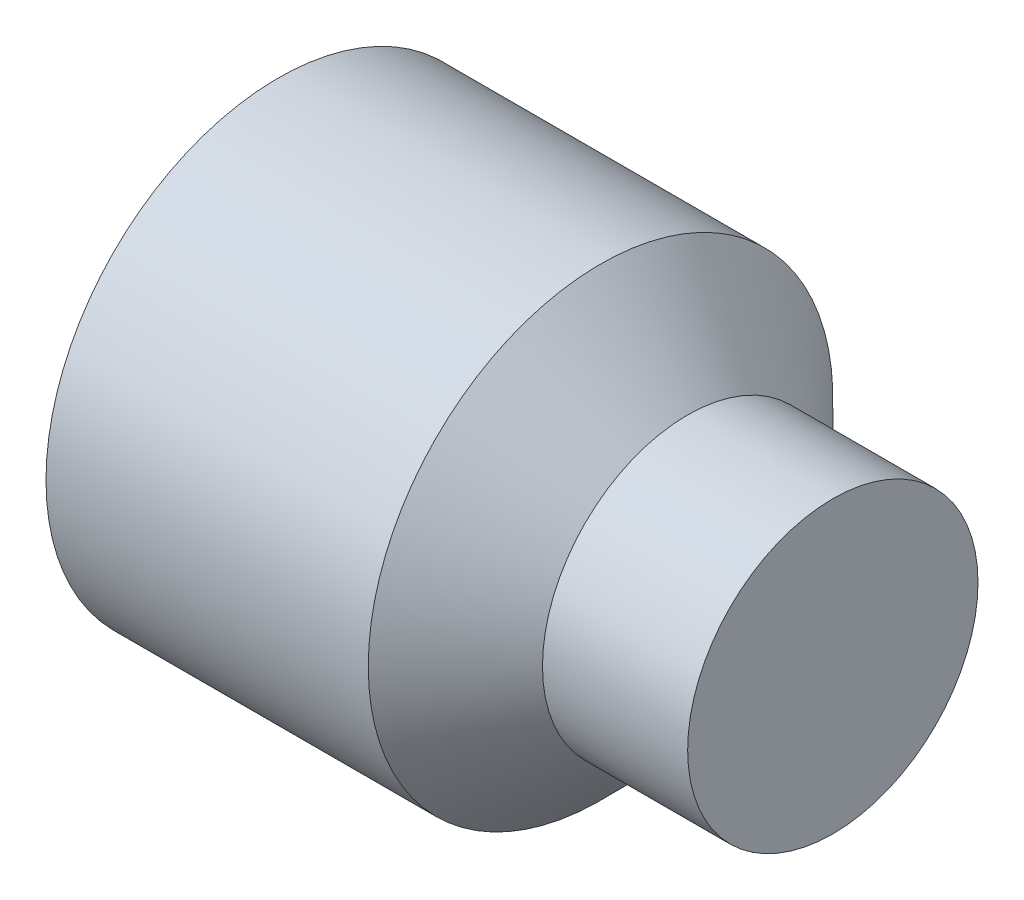
ISO-10303-21;
HEADER;
FILE_DESCRIPTION(('STEP AP214'),'2;1');
FILE_NAME('part.step','',(''),(''),'','','');
FILE_SCHEMA(('AUTOMOTIVE_DESIGN { 1 0 10303 214 1 1 1 1 }'));
ENDSEC;
DATA;
#1=APPLICATION_CONTEXT('core data for automotive mechanical design processes');
#2=APPLICATION_PROTOCOL_DEFINITION('international standard','automotive_design',2000,#1);
#3=PRODUCT_CONTEXT('',#1,'mechanical');
#4=PRODUCT('Part','Part','',(#3));
#5=PRODUCT_RELATED_PRODUCT_CATEGORY('part','',(#4));
#6=PRODUCT_DEFINITION_FORMATION('','',#4);
#7=PRODUCT_DEFINITION_CONTEXT('part definition',#1,'design');
#8=PRODUCT_DEFINITION('design','',#6,#7);
#9=PRODUCT_DEFINITION_SHAPE('','',#8);
#10=(LENGTH_UNIT() NAMED_UNIT(*) SI_UNIT(.MILLI.,.METRE.));
#11=(NAMED_UNIT(*) PLANE_ANGLE_UNIT() SI_UNIT($,.RADIAN.));
#12=(NAMED_UNIT(*) SI_UNIT($,.STERADIAN.) SOLID_ANGLE_UNIT());
#13=UNCERTAINTY_MEASURE_WITH_UNIT(LENGTH_MEASURE(1.E-05),#10,'distance_accuracy_value','');
#14=(GEOMETRIC_REPRESENTATION_CONTEXT(3) GLOBAL_UNCERTAINTY_ASSIGNED_CONTEXT((#13)) GLOBAL_UNIT_ASSIGNED_CONTEXT((#10,
#11,#12)) REPRESENTATION_CONTEXT('',''));
#15=CARTESIAN_POINT('',(0.,0.,0.));
#16=DIRECTION('',(0.,0.,1.));
#17=DIRECTION('',(1.,0.,0.));
#18=AXIS2_PLACEMENT_3D('',#15,#16,#17);
#19=CARTESIAN_POINT('',(0.,0.,0.));
#20=DIRECTION('',(-1.,0.,0.));
#21=DIRECTION('',(0.,0.,1.));
#22=AXIS2_PLACEMENT_3D('',#19,#20,#21);
#23=PLANE('',#22);
#24=CARTESIAN_POINT('',(0.,0.,0.));
#25=DIRECTION('',(-1.,0.,0.));
#26=DIRECTION('',(0.,0.,1.));
#27=AXIS2_PLACEMENT_3D('',#24,#25,#26);
#28=CIRCLE('',#27,1.61);
#29=CARTESIAN_POINT('',(0.,0.,1.61));
#30=VERTEX_POINT('',#29);
#31=EDGE_CURVE('E11',#30,#30,#28,.T.);
#32=ORIENTED_EDGE('',*,*,#31,.T.);
#33=EDGE_LOOP('',(#32));
#34=FACE_BOUND('',#33,.T.);
#35=DIRECTION('',(0.,0.,-1.));
#36=VECTOR('',#35,1.);
#37=CARTESIAN_POINT('',(0.,1.,0.577350269189623));
#38=LINE('',#37,#36);
#39=CARTESIAN_POINT('',(0.,1.,0.577350269189623));
#40=VERTEX_POINT('',#39);
#41=CARTESIAN_POINT('',(0.,1.,-0.577350269189629));
#42=VERTEX_POINT('',#41);
#43=EDGE_CURVE('E127',#40,#42,#38,.T.);
#44=ORIENTED_EDGE('',*,*,#43,.F.);
#45=DIRECTION('',(0.,-0.866025403784439,0.5));
#46=VECTOR('',#45,1.);
#47=CARTESIAN_POINT('',(0.,1.,0.577350269189623));
#48=LINE('',#47,#46);
#49=CARTESIAN_POINT('',(0.,0.,1.15470053837925));
#50=VERTEX_POINT('',#49);
#51=EDGE_CURVE('E49',#40,#50,#48,.T.);
#52=ORIENTED_EDGE('',*,*,#51,.T.);
#53=DIRECTION('',(0.,0.866025403784439,0.5));
#54=VECTOR('',#53,1.);
#55=CARTESIAN_POINT('',(0.,-0.999999999999997,0.577350269189623));
#56=LINE('',#55,#54);
#57=CARTESIAN_POINT('',(0.,-0.999999999999997,0.577350269189623));
#58=VERTEX_POINT('',#57);
#59=EDGE_CURVE('E118',#58,#50,#56,.T.);
#60=ORIENTED_EDGE('',*,*,#59,.F.);
#61=DIRECTION('',(0.,0.,-1.));
#62=VECTOR('',#61,1.);
#63=CARTESIAN_POINT('',(0.,-0.999999999999997,0.577350269189623));
#64=LINE('',#63,#62);
#65=CARTESIAN_POINT('',(0.,-0.999999999999997,-0.577350269189628));
#66=VERTEX_POINT('',#65);
#67=EDGE_CURVE('E121',#58,#66,#64,.T.);
#68=ORIENTED_EDGE('',*,*,#67,.T.);
#69=DIRECTION('',(0.,0.866025403784439,-0.5));
#70=VECTOR('',#69,1.);
#71=CARTESIAN_POINT('',(0.,-0.999999999999997,-0.577350269189628));
#72=LINE('',#71,#70);
#73=CARTESIAN_POINT('',(0.,0.,-1.15470053837925));
#74=VERTEX_POINT('',#73);
#75=EDGE_CURVE('E124',#66,#74,#72,.T.);
#76=ORIENTED_EDGE('',*,*,#75,.T.);
#77=DIRECTION('',(0.,-0.866025403784439,-0.499999999999999));
#78=VECTOR('',#77,1.);
#79=CARTESIAN_POINT('',(0.,1.,-0.577350269189629));
#80=LINE('',#79,#78);
#81=EDGE_CURVE('E107',#42,#74,#80,.T.);
#82=ORIENTED_EDGE('',*,*,#81,.F.);
#83=EDGE_LOOP('',(#44,#52,#60,#68,#76,#82));
#84=FACE_BOUND('',#83,.T.);
#85=ADVANCED_FACE('F35',(#34,#84),#23,.T.);
#86=CARTESIAN_POINT('',(0.,0.,0.));
#87=DIRECTION('',(1.,0.,0.));
#88=DIRECTION('',(0.,0.,-1.));
#89=AXIS2_PLACEMENT_3D('',#86,#87,#88);
#90=CONICAL_SURFACE('',#89,1.61,1.0471975511966);
#91=CARTESIAN_POINT('',(0.225166604983952,0.,0.));
#92=DIRECTION('',(-1.,0.,0.));
#93=DIRECTION('',(0.,0.,1.));
#94=AXIS2_PLACEMENT_3D('',#91,#92,#93);
#95=CIRCLE('',#94,2.);
#96=CARTESIAN_POINT('',(0.225166604983952,0.,2.));
#97=VERTEX_POINT('',#96);
#98=EDGE_CURVE('E42',#97,#97,#95,.T.);
#99=ORIENTED_EDGE('',*,*,#98,.T.);
#100=EDGE_LOOP('',(#99));
#101=FACE_BOUND('',#100,.T.);
#102=ORIENTED_EDGE('',*,*,#31,.F.);
#103=EDGE_LOOP('',(#102));
#104=FACE_BOUND('',#103,.T.);
#105=ADVANCED_FACE('F147',(#101,#104),#90,.T.);
#106=CARTESIAN_POINT('',(-12.7,0.,0.));
#107=DIRECTION('',(-1.,0.,0.));
#108=DIRECTION('',(0.,0.,1.));
#109=AXIS2_PLACEMENT_3D('',#106,#107,#108);
#110=CYLINDRICAL_SURFACE('',#109,2.);
#111=CARTESIAN_POINT('',(3.,0.,0.));
#112=DIRECTION('',(-1.,0.,0.));
#113=DIRECTION('',(0.,0.,1.));
#114=AXIS2_PLACEMENT_3D('',#111,#112,#113);
#115=CIRCLE('',#114,2.);
#116=CARTESIAN_POINT('',(3.,0.,2.));
#117=VERTEX_POINT('',#116);
#118=EDGE_CURVE('E142',#117,#117,#115,.T.);
#119=ORIENTED_EDGE('',*,*,#118,.T.);
#120=EDGE_LOOP('',(#119));
#121=FACE_BOUND('',#120,.T.);
#122=ORIENTED_EDGE('',*,*,#98,.F.);
#123=EDGE_LOOP('',(#122));
#124=FACE_BOUND('',#123,.T.);
#125=ADVANCED_FACE('F150',(#121,#124),#110,.T.);
#126=CARTESIAN_POINT('',(3.,0.,0.));
#127=DIRECTION('',(-1.,0.,0.));
#128=DIRECTION('',(0.,0.,1.));
#129=AXIS2_PLACEMENT_3D('',#126,#127,#128);
#130=CONICAL_SURFACE('',#129,2.,0.785398163397453);
#131=CARTESIAN_POINT('',(3.75,0.,0.));
#132=DIRECTION('',(-1.,0.,0.));
#133=DIRECTION('',(0.,0.,1.));
#134=AXIS2_PLACEMENT_3D('',#131,#132,#133);
#135=CIRCLE('',#134,1.25);
#136=CARTESIAN_POINT('',(3.75,0.,1.25));
#137=VERTEX_POINT('',#136);
#138=EDGE_CURVE('E139',#137,#137,#135,.T.);
#139=ORIENTED_EDGE('',*,*,#138,.T.);
#140=EDGE_LOOP('',(#139));
#141=FACE_BOUND('',#140,.T.);
#142=ORIENTED_EDGE('',*,*,#118,.F.);
#143=EDGE_LOOP('',(#142));
#144=FACE_BOUND('',#143,.T.);
#145=ADVANCED_FACE('F152',(#141,#144),#130,.T.);
#146=CARTESIAN_POINT('',(-12.7,0.,0.));
#147=DIRECTION('',(-1.,0.,0.));
#148=DIRECTION('',(0.,0.,1.));
#149=AXIS2_PLACEMENT_3D('',#146,#147,#148);
#150=CYLINDRICAL_SURFACE('',#149,1.25);
#151=CARTESIAN_POINT('',(5.,0.,0.));
#152=DIRECTION('',(-1.,0.,0.));
#153=DIRECTION('',(0.,0.,1.));
#154=AXIS2_PLACEMENT_3D('',#151,#152,#153);
#155=CIRCLE('',#154,1.25);
#156=CARTESIAN_POINT('',(5.,0.,1.25));
#157=VERTEX_POINT('',#156);
#158=EDGE_CURVE('E136',#157,#157,#155,.T.);
#159=ORIENTED_EDGE('',*,*,#158,.T.);
#160=EDGE_LOOP('',(#159));
#161=FACE_BOUND('',#160,.T.);
#162=ORIENTED_EDGE('',*,*,#138,.F.);
#163=EDGE_LOOP('',(#162));
#164=FACE_BOUND('',#163,.T.);
#165=ADVANCED_FACE('F159',(#161,#164),#150,.T.);
#166=CARTESIAN_POINT('',(5.,1.25,0.));
#167=DIRECTION('',(1.,0.,0.));
#168=DIRECTION('',(0.,0.,-1.));
#169=AXIS2_PLACEMENT_3D('',#166,#167,#168);
#170=PLANE('',#169);
#171=ORIENTED_EDGE('',*,*,#158,.F.);
#172=EDGE_LOOP('',(#171));
#173=FACE_BOUND('',#172,.T.);
#174=ADVANCED_FACE('F194',(#173),#170,.T.);
#175=CARTESIAN_POINT('',(1.5,1.,0.577350269189623));
#176=DIRECTION('',(0.,-0.5,-0.866025403784439));
#177=DIRECTION('',(0.,0.866025403784439,-0.5));
#178=AXIS2_PLACEMENT_3D('',#175,#176,#177);
#179=PLANE('',#178);
#180=ORIENTED_EDGE('',*,*,#51,.F.);
#181=DIRECTION('',(-1.,0.,0.));
#182=VECTOR('',#181,1.);
#183=CARTESIAN_POINT('',(1.5,1.,0.577350269189623));
#184=LINE('',#183,#182);
#185=CARTESIAN_POINT('',(1.5,1.,0.577350269189623));
#186=VERTEX_POINT('',#185);
#187=EDGE_CURVE('E54',#186,#40,#184,.T.);
#188=ORIENTED_EDGE('',*,*,#187,.F.);
#189=DIRECTION('',(0.,-0.866025403784439,0.5));
#190=VECTOR('',#189,1.);
#191=CARTESIAN_POINT('',(1.5,1.,0.577350269189623));
#192=LINE('',#191,#190);
#193=CARTESIAN_POINT('',(1.5,0.,1.15470053837925));
#194=VERTEX_POINT('',#193);
#195=EDGE_CURVE('E81',#186,#194,#192,.T.);
#196=ORIENTED_EDGE('',*,*,#195,.T.);
#197=DIRECTION('',(-1.,0.,0.));
#198=VECTOR('',#197,1.);
#199=CARTESIAN_POINT('',(1.5,0.,1.15470053837925));
#200=LINE('',#199,#198);
#201=EDGE_CURVE('E134',#194,#50,#200,.T.);
#202=ORIENTED_EDGE('',*,*,#201,.T.);
#203=EDGE_LOOP('',(#180,#188,#196,#202));
#204=FACE_BOUND('',#203,.T.);
#205=ADVANCED_FACE('F190',(#204),#179,.T.);
#206=CARTESIAN_POINT('',(1.5,-0.999999999999997,0.577350269189623));
#207=DIRECTION('',(0.,-0.5,0.866025403784439));
#208=DIRECTION('',(0.,-0.866025403784439,-0.5));
#209=AXIS2_PLACEMENT_3D('',#206,#207,#208);
#210=PLANE('',#209);
#211=ORIENTED_EDGE('',*,*,#59,.T.);
#212=ORIENTED_EDGE('',*,*,#201,.F.);
#213=DIRECTION('',(0.,0.866025403784439,0.5));
#214=VECTOR('',#213,1.);
#215=CARTESIAN_POINT('',(1.5,-0.999999999999997,0.577350269189623));
#216=LINE('',#215,#214);
#217=CARTESIAN_POINT('',(1.5,-0.999999999999997,0.577350269189623));
#218=VERTEX_POINT('',#217);
#219=EDGE_CURVE('E284',#218,#194,#216,.T.);
#220=ORIENTED_EDGE('',*,*,#219,.F.);
#221=DIRECTION('',(-1.,0.,0.));
#222=VECTOR('',#221,1.);
#223=CARTESIAN_POINT('',(1.5,-0.999999999999997,0.577350269189623));
#224=LINE('',#223,#222);
#225=EDGE_CURVE('E132',#218,#58,#224,.T.);
#226=ORIENTED_EDGE('',*,*,#225,.T.);
#227=EDGE_LOOP('',(#211,#212,#220,#226));
#228=FACE_BOUND('',#227,.T.);
#229=ADVANCED_FACE('F186',(#228),#210,.F.);
#230=CARTESIAN_POINT('',(1.5,-0.999999999999997,0.577350269189623));
#231=DIRECTION('',(0.,1.,0.));
#232=DIRECTION('',(0.,0.,1.));
#233=AXIS2_PLACEMENT_3D('',#230,#231,#232);
#234=PLANE('',#233);
#235=ORIENTED_EDGE('',*,*,#67,.F.);
#236=ORIENTED_EDGE('',*,*,#225,.F.);
#237=DIRECTION('',(0.,0.,-1.));
#238=VECTOR('',#237,1.);
#239=CARTESIAN_POINT('',(1.5,-0.999999999999997,0.577350269189623));
#240=LINE('',#239,#238);
#241=CARTESIAN_POINT('',(1.5,-0.999999999999997,-0.577350269189628));
#242=VERTEX_POINT('',#241);
#243=EDGE_CURVE('E102',#218,#242,#240,.T.);
#244=ORIENTED_EDGE('',*,*,#243,.T.);
#245=DIRECTION('',(-1.,0.,0.));
#246=VECTOR('',#245,1.);
#247=CARTESIAN_POINT('',(1.5,-0.999999999999997,-0.577350269189628));
#248=LINE('',#247,#246);
#249=EDGE_CURVE('E97',#242,#66,#248,.T.);
#250=ORIENTED_EDGE('',*,*,#249,.T.);
#251=EDGE_LOOP('',(#235,#236,#244,#250));
#252=FACE_BOUND('',#251,.T.);
#253=ADVANCED_FACE('F183',(#252),#234,.T.);
#254=CARTESIAN_POINT('',(1.5,-0.999999999999997,-0.577350269189628));
#255=DIRECTION('',(0.,0.5,0.866025403784439));
#256=DIRECTION('',(0.,-0.866025403784439,0.5));
#257=AXIS2_PLACEMENT_3D('',#254,#255,#256);
#258=PLANE('',#257);
#259=ORIENTED_EDGE('',*,*,#75,.F.);
#260=ORIENTED_EDGE('',*,*,#249,.F.);
#261=DIRECTION('',(0.,0.866025403784439,-0.5));
#262=VECTOR('',#261,1.);
#263=CARTESIAN_POINT('',(1.5,-0.999999999999997,-0.577350269189628));
#264=LINE('',#263,#262);
#265=CARTESIAN_POINT('',(1.5,0.,-1.15470053837925));
#266=VERTEX_POINT('',#265);
#267=EDGE_CURVE('E92',#242,#266,#264,.T.);
#268=ORIENTED_EDGE('',*,*,#267,.T.);
#269=DIRECTION('',(-1.,0.,0.));
#270=VECTOR('',#269,1.);
#271=CARTESIAN_POINT('',(1.5,0.,-1.15470053837925));
#272=LINE('',#271,#270);
#273=EDGE_CURVE('E96',#266,#74,#272,.T.);
#274=ORIENTED_EDGE('',*,*,#273,.T.);
#275=EDGE_LOOP('',(#259,#260,#268,#274));
#276=FACE_BOUND('',#275,.T.);
#277=ADVANCED_FACE('F95',(#276),#258,.T.);
#278=CARTESIAN_POINT('',(1.5,1.,-0.577350269189629));
#279=DIRECTION('',(0.,0.5,-0.866025403784439));
#280=DIRECTION('',(0.,0.866025403784439,0.5));
#281=AXIS2_PLACEMENT_3D('',#278,#279,#280);
#282=PLANE('',#281);
#283=ORIENTED_EDGE('',*,*,#81,.T.);
#284=ORIENTED_EDGE('',*,*,#273,.F.);
#285=DIRECTION('',(0.,-0.866025403784439,-0.499999999999999));
#286=VECTOR('',#285,1.);
#287=CARTESIAN_POINT('',(1.5,1.,-0.577350269189629));
#288=LINE('',#287,#286);
#289=CARTESIAN_POINT('',(1.5,1.,-0.577350269189629));
#290=VERTEX_POINT('',#289);
#291=EDGE_CURVE('E101',#290,#266,#288,.T.);
#292=ORIENTED_EDGE('',*,*,#291,.F.);
#293=DIRECTION('',(-1.,0.,0.));
#294=VECTOR('',#293,1.);
#295=CARTESIAN_POINT('',(1.5,1.,-0.577350269189629));
#296=LINE('',#295,#294);
#297=EDGE_CURVE('E77',#290,#42,#296,.T.);
#298=ORIENTED_EDGE('',*,*,#297,.T.);
#299=EDGE_LOOP('',(#283,#284,#292,#298));
#300=FACE_BOUND('',#299,.T.);
#301=ADVANCED_FACE('F104',(#300),#282,.F.);
#302=CARTESIAN_POINT('',(1.5,1.,0.577350269189623));
#303=DIRECTION('',(0.,1.,0.));
#304=DIRECTION('',(0.,0.,1.));
#305=AXIS2_PLACEMENT_3D('',#302,#303,#304);
#306=PLANE('',#305);
#307=ORIENTED_EDGE('',*,*,#43,.T.);
#308=ORIENTED_EDGE('',*,*,#297,.F.);
#309=DIRECTION('',(0.,0.,-1.));
#310=VECTOR('',#309,1.);
#311=CARTESIAN_POINT('',(1.5,1.,0.577350269189623));
#312=LINE('',#311,#310);
#313=EDGE_CURVE('E112',#186,#290,#312,.T.);
#314=ORIENTED_EDGE('',*,*,#313,.F.);
#315=ORIENTED_EDGE('',*,*,#187,.T.);
#316=EDGE_LOOP('',(#307,#308,#314,#315));
#317=FACE_BOUND('',#316,.T.);
#318=ADVANCED_FACE('F171',(#317),#306,.F.);
#319=CARTESIAN_POINT('',(1.5,-0.999999999999997,1.73205080756887));
#320=DIRECTION('',(1.,0.,0.));
#321=DIRECTION('',(0.,0.,-1.));
#322=AXIS2_PLACEMENT_3D('',#319,#320,#321);
#323=PLANE('',#322);
#324=ORIENTED_EDGE('',*,*,#195,.F.);
#325=ORIENTED_EDGE('',*,*,#313,.T.);
#326=ORIENTED_EDGE('',*,*,#291,.T.);
#327=ORIENTED_EDGE('',*,*,#267,.F.);
#328=ORIENTED_EDGE('',*,*,#243,.F.);
#329=ORIENTED_EDGE('',*,*,#219,.T.);
#330=EDGE_LOOP('',(#324,#325,#326,#327,#328,#329));
#331=FACE_BOUND('',#330,.T.);
#332=ADVANCED_FACE('F110',(#331),#323,.F.);
#333=CLOSED_SHELL('',(#85,#105,#125,#145,#165,#174,#205,#229,#253,#277,#301,#318,#332));
#334=MANIFOLD_SOLID_BREP('B2',#333);
#335=ADVANCED_BREP_SHAPE_REPRESENTATION('',(#18,#334),#14);
#336=SHAPE_DEFINITION_REPRESENTATION(#9,#335);
ENDSEC;
END-ISO-10303-21;
